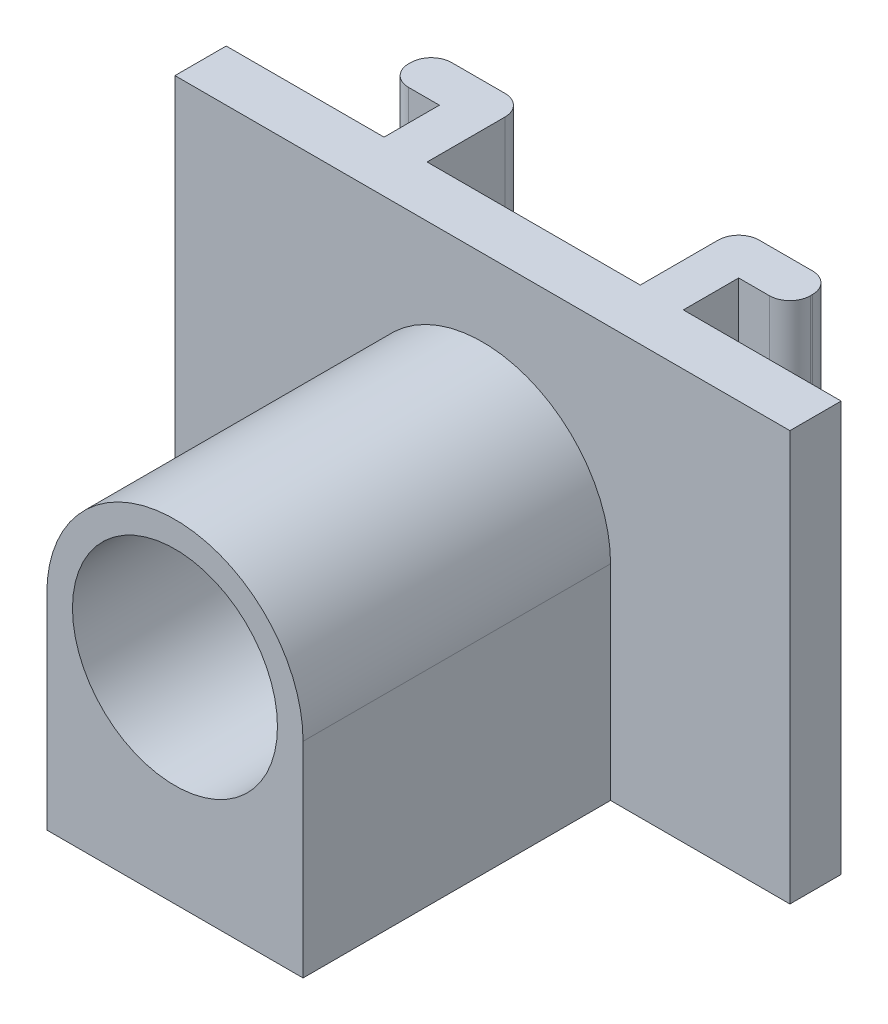
ISO-10303-21;
HEADER;
FILE_DESCRIPTION(('STEP AP214'),'2;1');
FILE_NAME('part.step','',(''),(''),'','','');
FILE_SCHEMA(('AUTOMOTIVE_DESIGN { 1 0 10303 214 1 1 1 1 }'));
ENDSEC;
DATA;
#1=APPLICATION_CONTEXT('core data for automotive mechanical design processes');
#2=APPLICATION_PROTOCOL_DEFINITION('international standard','automotive_design',2000,#1);
#3=PRODUCT_CONTEXT('',#1,'mechanical');
#4=PRODUCT('Part','Part','',(#3));
#5=PRODUCT_RELATED_PRODUCT_CATEGORY('part','',(#4));
#6=PRODUCT_DEFINITION_FORMATION('','',#4);
#7=PRODUCT_DEFINITION_CONTEXT('part definition',#1,'design');
#8=PRODUCT_DEFINITION('design','',#6,#7);
#9=PRODUCT_DEFINITION_SHAPE('','',#8);
#10=(LENGTH_UNIT() NAMED_UNIT(*) SI_UNIT(.MILLI.,.METRE.));
#11=(NAMED_UNIT(*) PLANE_ANGLE_UNIT() SI_UNIT($,.RADIAN.));
#12=(NAMED_UNIT(*) SI_UNIT($,.STERADIAN.) SOLID_ANGLE_UNIT());
#13=UNCERTAINTY_MEASURE_WITH_UNIT(LENGTH_MEASURE(1.E-05),#10,'distance_accuracy_value','');
#14=(GEOMETRIC_REPRESENTATION_CONTEXT(3) GLOBAL_UNCERTAINTY_ASSIGNED_CONTEXT((#13)) GLOBAL_UNIT_ASSIGNED_CONTEXT((#10,
#11,#12)) REPRESENTATION_CONTEXT('',''));
#15=CARTESIAN_POINT('',(0.,0.,0.));
#16=DIRECTION('',(0.,0.,1.));
#17=DIRECTION('',(1.,0.,0.));
#18=AXIS2_PLACEMENT_3D('',#15,#16,#17);
#19=CARTESIAN_POINT('',(0.,0.,3.175));
#20=DIRECTION('',(0.,0.,-1.));
#21=DIRECTION('',(-1.,0.,0.));
#22=AXIS2_PLACEMENT_3D('',#19,#20,#21);
#23=PLANE('',#22);
#24=DIRECTION('',(0.,1.,0.));
#25=VECTOR('',#24,1.);
#26=CARTESIAN_POINT('',(7.9375,0.,3.175));
#27=LINE('',#26,#25);
#28=CARTESIAN_POINT('',(7.93749999999999,-12.7,3.175));
#29=VERTEX_POINT('',#28);
#30=CARTESIAN_POINT('',(7.9375,0.,3.175));
#31=VERTEX_POINT('',#30);
#32=EDGE_CURVE('E224',#29,#31,#27,.T.);
#33=ORIENTED_EDGE('',*,*,#32,.F.);
#34=DIRECTION('',(1.,0.,0.));
#35=VECTOR('',#34,1.);
#36=CARTESIAN_POINT('',(-19.05,-12.7,3.175));
#37=LINE('',#36,#35);
#38=CARTESIAN_POINT('',(19.05,-12.7,3.175));
#39=VERTEX_POINT('',#38);
#40=EDGE_CURVE('E322',#29,#39,#37,.T.);
#41=ORIENTED_EDGE('',*,*,#40,.T.);
#42=DIRECTION('',(0.,1.,0.));
#43=VECTOR('',#42,1.);
#44=CARTESIAN_POINT('',(19.05,-12.7,3.175));
#45=LINE('',#44,#43);
#46=CARTESIAN_POINT('',(19.05,12.7,3.175));
#47=VERTEX_POINT('',#46);
#48=EDGE_CURVE('E314',#39,#47,#45,.T.);
#49=ORIENTED_EDGE('',*,*,#48,.T.);
#50=DIRECTION('',(-1.,0.,0.));
#51=VECTOR('',#50,1.);
#52=CARTESIAN_POINT('',(-19.05,12.7,3.175));
#53=LINE('',#52,#51);
#54=CARTESIAN_POINT('',(-19.05,12.7,3.175));
#55=VERTEX_POINT('',#54);
#56=EDGE_CURVE('E317',#47,#55,#53,.T.);
#57=ORIENTED_EDGE('',*,*,#56,.T.);
#58=DIRECTION('',(0.,-1.,0.));
#59=VECTOR('',#58,1.);
#60=CARTESIAN_POINT('',(-19.05,-12.7,3.175));
#61=LINE('',#60,#59);
#62=CARTESIAN_POINT('',(-19.05,-12.7,3.175));
#63=VERTEX_POINT('',#62);
#64=EDGE_CURVE('E320',#55,#63,#61,.T.);
#65=ORIENTED_EDGE('',*,*,#64,.T.);
#66=CARTESIAN_POINT('',(-7.9375,-12.7,3.175));
#67=VERTEX_POINT('',#66);
#68=EDGE_CURVE('E330',#63,#67,#37,.T.);
#69=ORIENTED_EDGE('',*,*,#68,.T.);
#70=DIRECTION('',(0.,-1.,0.));
#71=VECTOR('',#70,1.);
#72=CARTESIAN_POINT('',(-7.9375,-12.7,3.175));
#73=LINE('',#72,#71);
#74=CARTESIAN_POINT('',(-7.9375,0.,3.175));
#75=VERTEX_POINT('',#74);
#76=EDGE_CURVE('E55',#75,#67,#73,.T.);
#77=ORIENTED_EDGE('',*,*,#76,.F.);
#78=CARTESIAN_POINT('',(0.,0.,3.175));
#79=DIRECTION('',(0.,0.,1.));
#80=DIRECTION('',(-1.,0.,0.));
#81=AXIS2_PLACEMENT_3D('',#78,#79,#80);
#82=CIRCLE('',#81,7.9375);
#83=EDGE_CURVE('E50',#31,#75,#82,.T.);
#84=ORIENTED_EDGE('',*,*,#83,.F.);
#85=EDGE_LOOP('',(#33,#41,#49,#57,#65,#69,#77,#84));
#86=FACE_BOUND('',#85,.T.);
#87=ADVANCED_FACE('F33',(#86),#23,.F.);
#88=CARTESIAN_POINT('',(-19.05,12.7,3.175));
#89=DIRECTION('',(0.,-1.,0.));
#90=DIRECTION('',(0.,0.,-1.));
#91=AXIS2_PLACEMENT_3D('',#88,#89,#90);
#92=PLANE('',#91);
#93=DIRECTION('',(0.,0.,-1.));
#94=VECTOR('',#93,1.);
#95=CARTESIAN_POINT('',(-6.60399999999998,12.7,0.));
#96=LINE('',#95,#94);
#97=CARTESIAN_POINT('',(-6.60399999999998,12.7,0.));
#98=VERTEX_POINT('',#97);
#99=CARTESIAN_POINT('',(-6.60399999999998,12.7,-4.826));
#100=VERTEX_POINT('',#99);
#101=EDGE_CURVE('E259',#98,#100,#96,.T.);
#102=ORIENTED_EDGE('',*,*,#101,.T.);
#103=CARTESIAN_POINT('',(-7.87399999999997,12.7,-4.82600000000001));
#104=DIRECTION('',(0.,-1.,0.));
#105=DIRECTION('',(0.,0.,-1.));
#106=AXIS2_PLACEMENT_3D('',#103,#104,#105);
#107=CIRCLE('',#106,1.27);
#108=CARTESIAN_POINT('',(-7.87399999999997,12.7,-6.09600000000001));
#109=VERTEX_POINT('',#108);
#110=EDGE_CURVE('E369',#100,#109,#107,.F.);
#111=ORIENTED_EDGE('',*,*,#110,.T.);
#112=DIRECTION('',(-1.,0.,0.));
#113=VECTOR('',#112,1.);
#114=CARTESIAN_POINT('',(-6.60399999999997,12.7,-6.09600000000001));
#115=LINE('',#114,#113);
#116=CARTESIAN_POINT('',(-11.176,12.7,-6.09600000000001));
#117=VERTEX_POINT('',#116);
#118=EDGE_CURVE('E256',#109,#117,#115,.T.);
#119=ORIENTED_EDGE('',*,*,#118,.T.);
#120=CARTESIAN_POINT('',(-11.176,12.7,-4.82600000000001));
#121=DIRECTION('',(0.,-1.,0.));
#122=DIRECTION('',(0.,0.,-1.));
#123=AXIS2_PLACEMENT_3D('',#120,#121,#122);
#124=CIRCLE('',#123,1.27);
#125=CARTESIAN_POINT('',(-12.446,12.7,-4.826));
#126=VERTEX_POINT('',#125);
#127=EDGE_CURVE('E373',#117,#126,#124,.F.);
#128=ORIENTED_EDGE('',*,*,#127,.T.);
#129=DIRECTION('',(0.,0.,1.));
#130=VECTOR('',#129,1.);
#131=CARTESIAN_POINT('',(-12.446,12.7,-6.09600000000001));
#132=LINE('',#131,#130);
#133=CARTESIAN_POINT('',(-12.446,12.7,-4.699));
#134=VERTEX_POINT('',#133);
#135=EDGE_CURVE('E253',#126,#134,#132,.T.);
#136=ORIENTED_EDGE('',*,*,#135,.T.);
#137=CARTESIAN_POINT('',(-11.176,12.7,-4.69900000000001));
#138=DIRECTION('',(0.,-1.,0.));
#139=DIRECTION('',(0.,0.,-1.));
#140=AXIS2_PLACEMENT_3D('',#137,#138,#139);
#141=CIRCLE('',#140,1.27);
#142=CARTESIAN_POINT('',(-11.176,12.7,-3.42900000000001));
#143=VERTEX_POINT('',#142);
#144=EDGE_CURVE('E371',#134,#143,#141,.F.);
#145=ORIENTED_EDGE('',*,*,#144,.T.);
#146=DIRECTION('',(1.,0.,0.));
#147=VECTOR('',#146,1.);
#148=CARTESIAN_POINT('',(-12.446,12.7,-3.42900000000001));
#149=LINE('',#148,#147);
#150=CARTESIAN_POINT('',(-9.27099999999998,12.7,-3.42900000000001));
#151=VERTEX_POINT('',#150);
#152=EDGE_CURVE('E251',#143,#151,#149,.T.);
#153=ORIENTED_EDGE('',*,*,#152,.T.);
#154=DIRECTION('',(0.,0.,1.));
#155=VECTOR('',#154,1.);
#156=CARTESIAN_POINT('',(-9.27099999999998,12.7,-3.42900000000001));
#157=LINE('',#156,#155);
#158=CARTESIAN_POINT('',(-9.27099999999998,12.7,0.));
#159=VERTEX_POINT('',#158);
#160=EDGE_CURVE('E248',#151,#159,#157,.T.);
#161=ORIENTED_EDGE('',*,*,#160,.T.);
#162=DIRECTION('',(-1.,0.,0.));
#163=VECTOR('',#162,1.);
#164=CARTESIAN_POINT('',(-19.05,12.7,0.));
#165=LINE('',#164,#163);
#166=CARTESIAN_POINT('',(-19.05,12.7,0.));
#167=VERTEX_POINT('',#166);
#168=EDGE_CURVE('E385',#159,#167,#165,.T.);
#169=ORIENTED_EDGE('',*,*,#168,.T.);
#170=DIRECTION('',(0.,0.,-1.));
#171=VECTOR('',#170,1.);
#172=CARTESIAN_POINT('',(-19.05,12.7,3.175));
#173=LINE('',#172,#171);
#174=EDGE_CURVE('E403',#55,#167,#173,.T.);
#175=ORIENTED_EDGE('',*,*,#174,.F.);
#176=ORIENTED_EDGE('',*,*,#56,.F.);
#177=DIRECTION('',(0.,0.,-1.));
#178=VECTOR('',#177,1.);
#179=CARTESIAN_POINT('',(19.05,12.7,3.175));
#180=LINE('',#179,#178);
#181=CARTESIAN_POINT('',(19.05,12.7,0.));
#182=VERTEX_POINT('',#181);
#183=EDGE_CURVE('E384',#47,#182,#180,.T.);
#184=ORIENTED_EDGE('',*,*,#183,.T.);
#185=CARTESIAN_POINT('',(9.27099999999997,12.7,0.));
#186=VERTEX_POINT('',#185);
#187=EDGE_CURVE('E387',#182,#186,#165,.T.);
#188=ORIENTED_EDGE('',*,*,#187,.T.);
#189=DIRECTION('',(0.,0.,1.));
#190=VECTOR('',#189,1.);
#191=CARTESIAN_POINT('',(9.27099999999997,12.7,-3.429));
#192=LINE('',#191,#190);
#193=CARTESIAN_POINT('',(9.27099999999997,12.7,-3.429));
#194=VERTEX_POINT('',#193);
#195=EDGE_CURVE('E296',#194,#186,#192,.T.);
#196=ORIENTED_EDGE('',*,*,#195,.F.);
#197=DIRECTION('',(-1.,0.,0.));
#198=VECTOR('',#197,1.);
#199=CARTESIAN_POINT('',(12.446,12.7,-3.429));
#200=LINE('',#199,#198);
#201=CARTESIAN_POINT('',(11.176,12.7,-3.429));
#202=VERTEX_POINT('',#201);
#203=EDGE_CURVE('E294',#202,#194,#200,.T.);
#204=ORIENTED_EDGE('',*,*,#203,.F.);
#205=CARTESIAN_POINT('',(11.176,12.7,-4.699));
#206=DIRECTION('',(0.,-1.,0.));
#207=DIRECTION('',(0.,0.,-1.));
#208=AXIS2_PLACEMENT_3D('',#205,#206,#207);
#209=CIRCLE('',#208,1.27);
#210=CARTESIAN_POINT('',(12.446,12.7,-4.69899999999999));
#211=VERTEX_POINT('',#210);
#212=EDGE_CURVE('E375',#202,#211,#209,.F.);
#213=ORIENTED_EDGE('',*,*,#212,.T.);
#214=DIRECTION('',(0.,0.,1.));
#215=VECTOR('',#214,1.);
#216=CARTESIAN_POINT('',(12.446,12.7,-6.096));
#217=LINE('',#216,#215);
#218=CARTESIAN_POINT('',(12.446,12.7,-4.82599999999999));
#219=VERTEX_POINT('',#218);
#220=EDGE_CURVE('E291',#219,#211,#217,.T.);
#221=ORIENTED_EDGE('',*,*,#220,.F.);
#222=CARTESIAN_POINT('',(11.176,12.7,-4.826));
#223=DIRECTION('',(0.,-1.,0.));
#224=DIRECTION('',(0.,0.,-1.));
#225=AXIS2_PLACEMENT_3D('',#222,#223,#224);
#226=CIRCLE('',#225,1.27);
#227=CARTESIAN_POINT('',(11.176,12.7,-6.096));
#228=VERTEX_POINT('',#227);
#229=EDGE_CURVE('E377',#219,#228,#226,.F.);
#230=ORIENTED_EDGE('',*,*,#229,.T.);
#231=DIRECTION('',(1.,0.,0.));
#232=VECTOR('',#231,1.);
#233=CARTESIAN_POINT('',(6.60399999999998,12.7,-6.096));
#234=LINE('',#233,#232);
#235=CARTESIAN_POINT('',(7.87399999999997,12.7,-6.096));
#236=VERTEX_POINT('',#235);
#237=EDGE_CURVE('E288',#236,#228,#234,.T.);
#238=ORIENTED_EDGE('',*,*,#237,.F.);
#239=CARTESIAN_POINT('',(7.87399999999997,12.7,-4.826));
#240=DIRECTION('',(0.,-1.,0.));
#241=DIRECTION('',(0.,0.,-1.));
#242=AXIS2_PLACEMENT_3D('',#239,#240,#241);
#243=CIRCLE('',#242,1.27);
#244=CARTESIAN_POINT('',(6.60399999999998,12.7,-4.826));
#245=VERTEX_POINT('',#244);
#246=EDGE_CURVE('E379',#236,#245,#243,.F.);
#247=ORIENTED_EDGE('',*,*,#246,.T.);
#248=DIRECTION('',(0.,0.,-1.));
#249=VECTOR('',#248,1.);
#250=CARTESIAN_POINT('',(6.60399999999998,12.7,0.));
#251=LINE('',#250,#249);
#252=CARTESIAN_POINT('',(6.60399999999998,12.7,0.));
#253=VERTEX_POINT('',#252);
#254=EDGE_CURVE('E285',#253,#245,#251,.T.);
#255=ORIENTED_EDGE('',*,*,#254,.F.);
#256=DIRECTION('',(1.,0.,0.));
#257=VECTOR('',#256,1.);
#258=CARTESIAN_POINT('',(6.34999999999998,12.7,0.));
#259=LINE('',#258,#257);
#260=EDGE_CURVE('E311',#98,#253,#259,.T.);
#261=ORIENTED_EDGE('',*,*,#260,.F.);
#262=EDGE_LOOP('',(#102,#111,#119,#128,#136,#145,#153,#161,#169,#175,#176,#184,#188,#196,#204,
#213,#221,#230,#238,#247,#255,#261));
#263=FACE_BOUND('',#262,.T.);
#264=ADVANCED_FACE('F425',(#263),#92,.F.);
#265=CARTESIAN_POINT('',(-19.05,-12.7,3.175));
#266=DIRECTION('',(0.,1.,0.));
#267=DIRECTION('',(0.,0.,1.));
#268=AXIS2_PLACEMENT_3D('',#265,#266,#267);
#269=PLANE('',#268);
#270=DIRECTION('',(1.,0.,0.));
#271=VECTOR('',#270,1.);
#272=CARTESIAN_POINT('',(-6.60399999999997,-12.7,-6.09600000000001));
#273=LINE('',#272,#271);
#274=CARTESIAN_POINT('',(-11.176,-12.7,-6.09600000000001));
#275=VERTEX_POINT('',#274);
#276=CARTESIAN_POINT('',(-7.87399999999997,-12.7,-6.09600000000001));
#277=VERTEX_POINT('',#276);
#278=EDGE_CURVE('E243',#275,#277,#273,.T.);
#279=ORIENTED_EDGE('',*,*,#278,.T.);
#280=CARTESIAN_POINT('',(-7.87399999999997,-12.7,-4.82600000000001));
#281=DIRECTION('',(0.,1.,0.));
#282=DIRECTION('',(0.,0.,1.));
#283=AXIS2_PLACEMENT_3D('',#280,#281,#282);
#284=CIRCLE('',#283,1.27);
#285=CARTESIAN_POINT('',(-6.60399999999997,-12.7,-4.826));
#286=VERTEX_POINT('',#285);
#287=EDGE_CURVE('E352',#277,#286,#284,.F.);
#288=ORIENTED_EDGE('',*,*,#287,.T.);
#289=DIRECTION('',(0.,0.,1.));
#290=VECTOR('',#289,1.);
#291=CARTESIAN_POINT('',(-6.60399999999997,-12.7,0.));
#292=LINE('',#291,#290);
#293=CARTESIAN_POINT('',(-6.60399999999997,-12.7,0.));
#294=VERTEX_POINT('',#293);
#295=EDGE_CURVE('E246',#286,#294,#292,.T.);
#296=ORIENTED_EDGE('',*,*,#295,.T.);
#297=DIRECTION('',(-1.,0.,0.));
#298=VECTOR('',#297,1.);
#299=CARTESIAN_POINT('',(6.34999999999998,-12.7,0.));
#300=LINE('',#299,#298);
#301=CARTESIAN_POINT('',(6.60399999999998,-12.7,0.));
#302=VERTEX_POINT('',#301);
#303=EDGE_CURVE('E303',#302,#294,#300,.T.);
#304=ORIENTED_EDGE('',*,*,#303,.F.);
#305=DIRECTION('',(0.,0.,1.));
#306=VECTOR('',#305,1.);
#307=CARTESIAN_POINT('',(6.60399999999998,-12.7,0.));
#308=LINE('',#307,#306);
#309=CARTESIAN_POINT('',(6.60399999999998,-12.7,-4.826));
#310=VERTEX_POINT('',#309);
#311=EDGE_CURVE('E266',#310,#302,#308,.T.);
#312=ORIENTED_EDGE('',*,*,#311,.F.);
#313=CARTESIAN_POINT('',(7.87399999999997,-12.7,-4.826));
#314=DIRECTION('',(0.,1.,0.));
#315=DIRECTION('',(0.,0.,1.));
#316=AXIS2_PLACEMENT_3D('',#313,#314,#315);
#317=CIRCLE('',#316,1.27);
#318=CARTESIAN_POINT('',(7.87399999999997,-12.7,-6.096));
#319=VERTEX_POINT('',#318);
#320=EDGE_CURVE('E362',#310,#319,#317,.F.);
#321=ORIENTED_EDGE('',*,*,#320,.T.);
#322=DIRECTION('',(-1.,0.,0.));
#323=VECTOR('',#322,1.);
#324=CARTESIAN_POINT('',(6.60399999999998,-12.7,-6.096));
#325=LINE('',#324,#323);
#326=CARTESIAN_POINT('',(11.176,-12.7,-6.096));
#327=VERTEX_POINT('',#326);
#328=EDGE_CURVE('E273',#327,#319,#325,.T.);
#329=ORIENTED_EDGE('',*,*,#328,.F.);
#330=CARTESIAN_POINT('',(11.176,-12.7,-4.826));
#331=DIRECTION('',(0.,1.,0.));
#332=DIRECTION('',(0.,0.,1.));
#333=AXIS2_PLACEMENT_3D('',#330,#331,#332);
#334=CIRCLE('',#333,1.27);
#335=CARTESIAN_POINT('',(12.446,-12.7,-4.82599999999999));
#336=VERTEX_POINT('',#335);
#337=EDGE_CURVE('E360',#327,#336,#334,.F.);
#338=ORIENTED_EDGE('',*,*,#337,.T.);
#339=DIRECTION('',(0.,0.,-1.));
#340=VECTOR('',#339,1.);
#341=CARTESIAN_POINT('',(12.446,-12.7,-6.096));
#342=LINE('',#341,#340);
#343=CARTESIAN_POINT('',(12.446,-12.7,-4.69899999999999));
#344=VERTEX_POINT('',#343);
#345=EDGE_CURVE('E276',#344,#336,#342,.T.);
#346=ORIENTED_EDGE('',*,*,#345,.F.);
#347=CARTESIAN_POINT('',(11.176,-12.7,-4.699));
#348=DIRECTION('',(0.,1.,0.));
#349=DIRECTION('',(0.,0.,1.));
#350=AXIS2_PLACEMENT_3D('',#347,#348,#349);
#351=CIRCLE('',#350,1.27);
#352=CARTESIAN_POINT('',(11.176,-12.7,-3.429));
#353=VERTEX_POINT('',#352);
#354=EDGE_CURVE('E358',#344,#353,#351,.F.);
#355=ORIENTED_EDGE('',*,*,#354,.T.);
#356=DIRECTION('',(1.,0.,0.));
#357=VECTOR('',#356,1.);
#358=CARTESIAN_POINT('',(12.446,-12.7,-3.429));
#359=LINE('',#358,#357);
#360=CARTESIAN_POINT('',(9.27099999999997,-12.7,-3.429));
#361=VERTEX_POINT('',#360);
#362=EDGE_CURVE('E279',#361,#353,#359,.T.);
#363=ORIENTED_EDGE('',*,*,#362,.F.);
#364=DIRECTION('',(0.,0.,-1.));
#365=VECTOR('',#364,1.);
#366=CARTESIAN_POINT('',(9.27099999999997,-12.7,-3.429));
#367=LINE('',#366,#365);
#368=CARTESIAN_POINT('',(9.27099999999997,-12.7,0.));
#369=VERTEX_POINT('',#368);
#370=EDGE_CURVE('E282',#369,#361,#367,.T.);
#371=ORIENTED_EDGE('',*,*,#370,.F.);
#372=DIRECTION('',(1.,0.,0.));
#373=VECTOR('',#372,1.);
#374=CARTESIAN_POINT('',(-19.05,-12.7,0.));
#375=LINE('',#374,#373);
#376=CARTESIAN_POINT('',(19.05,-12.7,0.));
#377=VERTEX_POINT('',#376);
#378=EDGE_CURVE('E394',#369,#377,#375,.T.);
#379=ORIENTED_EDGE('',*,*,#378,.T.);
#380=DIRECTION('',(0.,0.,-1.));
#381=VECTOR('',#380,1.);
#382=CARTESIAN_POINT('',(19.05,-12.7,3.175));
#383=LINE('',#382,#381);
#384=EDGE_CURVE('E331',#39,#377,#383,.T.);
#385=ORIENTED_EDGE('',*,*,#384,.F.);
#386=ORIENTED_EDGE('',*,*,#40,.F.);
#387=DIRECTION('',(0.,0.,-1.));
#388=VECTOR('',#387,1.);
#389=CARTESIAN_POINT('',(7.9375,-12.7,22.225));
#390=LINE('',#389,#388);
#391=CARTESIAN_POINT('',(7.9375,-12.7,22.225));
#392=VERTEX_POINT('',#391);
#393=EDGE_CURVE('E232',#392,#29,#390,.T.);
#394=ORIENTED_EDGE('',*,*,#393,.F.);
#395=DIRECTION('',(1.,0.,0.));
#396=VECTOR('',#395,1.);
#397=CARTESIAN_POINT('',(7.9375,-12.7,22.225));
#398=LINE('',#397,#396);
#399=CARTESIAN_POINT('',(-7.9375,-12.7,22.225));
#400=VERTEX_POINT('',#399);
#401=EDGE_CURVE('E214',#400,#392,#398,.T.);
#402=ORIENTED_EDGE('',*,*,#401,.F.);
#403=DIRECTION('',(0.,0.,-1.));
#404=VECTOR('',#403,1.);
#405=CARTESIAN_POINT('',(-7.9375,-12.7,22.225));
#406=LINE('',#405,#404);
#407=EDGE_CURVE('E211',#400,#67,#406,.T.);
#408=ORIENTED_EDGE('',*,*,#407,.T.);
#409=ORIENTED_EDGE('',*,*,#68,.F.);
#410=DIRECTION('',(0.,0.,-1.));
#411=VECTOR('',#410,1.);
#412=CARTESIAN_POINT('',(-19.05,-12.7,3.175));
#413=LINE('',#412,#411);
#414=CARTESIAN_POINT('',(-19.05,-12.7,0.));
#415=VERTEX_POINT('',#414);
#416=EDGE_CURVE('E405',#63,#415,#413,.T.);
#417=ORIENTED_EDGE('',*,*,#416,.T.);
#418=CARTESIAN_POINT('',(-9.27099999999997,-12.7,0.));
#419=VERTEX_POINT('',#418);
#420=EDGE_CURVE('E318',#415,#419,#375,.T.);
#421=ORIENTED_EDGE('',*,*,#420,.T.);
#422=DIRECTION('',(0.,0.,-1.));
#423=VECTOR('',#422,1.);
#424=CARTESIAN_POINT('',(-9.27099999999997,-12.7,-3.42900000000001));
#425=LINE('',#424,#423);
#426=CARTESIAN_POINT('',(-9.27099999999997,-12.7,-3.42900000000001));
#427=VERTEX_POINT('',#426);
#428=EDGE_CURVE('E227',#419,#427,#425,.T.);
#429=ORIENTED_EDGE('',*,*,#428,.T.);
#430=DIRECTION('',(-1.,0.,0.));
#431=VECTOR('',#430,1.);
#432=CARTESIAN_POINT('',(-12.446,-12.7,-3.42900000000001));
#433=LINE('',#432,#431);
#434=CARTESIAN_POINT('',(-11.176,-12.7,-3.42900000000001));
#435=VERTEX_POINT('',#434);
#436=EDGE_CURVE('E230',#427,#435,#433,.T.);
#437=ORIENTED_EDGE('',*,*,#436,.T.);
#438=CARTESIAN_POINT('',(-11.176,-12.7,-4.69900000000001));
#439=DIRECTION('',(0.,1.,0.));
#440=DIRECTION('',(0.,0.,1.));
#441=AXIS2_PLACEMENT_3D('',#438,#439,#440);
#442=CIRCLE('',#441,1.27);
#443=CARTESIAN_POINT('',(-12.446,-12.7,-4.699));
#444=VERTEX_POINT('',#443);
#445=EDGE_CURVE('E354',#435,#444,#442,.F.);
#446=ORIENTED_EDGE('',*,*,#445,.T.);
#447=DIRECTION('',(0.,0.,-1.));
#448=VECTOR('',#447,1.);
#449=CARTESIAN_POINT('',(-12.446,-12.7,-6.09600000000001));
#450=LINE('',#449,#448);
#451=CARTESIAN_POINT('',(-12.446,-12.7,-4.826));
#452=VERTEX_POINT('',#451);
#453=EDGE_CURVE('E240',#444,#452,#450,.T.);
#454=ORIENTED_EDGE('',*,*,#453,.T.);
#455=CARTESIAN_POINT('',(-11.176,-12.7,-4.82600000000001));
#456=DIRECTION('',(0.,1.,0.));
#457=DIRECTION('',(0.,0.,1.));
#458=AXIS2_PLACEMENT_3D('',#455,#456,#457);
#459=CIRCLE('',#458,1.27);
#460=EDGE_CURVE('E356',#452,#275,#459,.F.);
#461=ORIENTED_EDGE('',*,*,#460,.T.);
#462=EDGE_LOOP('',(#279,#288,#296,#304,#312,#321,#329,#338,#346,#355,#363,#371,#379,#385,#386,
#394,#402,#408,#409,#417,#421,#429,#437,#446,#454,#461));
#463=FACE_BOUND('',#462,.T.);
#464=ADVANCED_FACE('F430',(#463),#269,.F.);
#465=CARTESIAN_POINT('',(0.,0.,0.));
#466=DIRECTION('',(0.,0.,-1.));
#467=DIRECTION('',(-1.,0.,0.));
#468=AXIS2_PLACEMENT_3D('',#465,#466,#467);
#469=PLANE('',#468);
#470=ORIENTED_EDGE('',*,*,#378,.F.);
#471=DIRECTION('',(0.,1.,0.));
#472=VECTOR('',#471,1.);
#473=CARTESIAN_POINT('',(9.27099999999997,-12.70105,0.));
#474=LINE('',#473,#472);
#475=EDGE_CURVE('E300',#369,#186,#474,.T.);
#476=ORIENTED_EDGE('',*,*,#475,.T.);
#477=ORIENTED_EDGE('',*,*,#187,.F.);
#478=DIRECTION('',(0.,1.,0.));
#479=VECTOR('',#478,1.);
#480=CARTESIAN_POINT('',(19.05,-12.7,0.));
#481=LINE('',#480,#479);
#482=EDGE_CURVE('E313',#377,#182,#481,.T.);
#483=ORIENTED_EDGE('',*,*,#482,.F.);
#484=EDGE_LOOP('',(#470,#476,#477,#483));
#485=FACE_BOUND('',#484,.T.);
#486=ADVANCED_FACE('F421',(#485),#469,.T.);
#487=CARTESIAN_POINT('',(19.05,-12.7,3.175));
#488=DIRECTION('',(-1.,0.,0.));
#489=DIRECTION('',(0.,0.,1.));
#490=AXIS2_PLACEMENT_3D('',#487,#488,#489);
#491=PLANE('',#490);
#492=ORIENTED_EDGE('',*,*,#482,.T.);
#493=ORIENTED_EDGE('',*,*,#183,.F.);
#494=ORIENTED_EDGE('',*,*,#48,.F.);
#495=ORIENTED_EDGE('',*,*,#384,.T.);
#496=EDGE_LOOP('',(#492,#493,#494,#495));
#497=FACE_BOUND('',#496,.T.);
#498=ADVANCED_FACE('F417',(#497),#491,.F.);
#499=CARTESIAN_POINT('',(-19.05,-12.7,3.175));
#500=DIRECTION('',(1.,0.,0.));
#501=DIRECTION('',(0.,0.,-1.));
#502=AXIS2_PLACEMENT_3D('',#499,#500,#501);
#503=PLANE('',#502);
#504=DIRECTION('',(0.,-1.,0.));
#505=VECTOR('',#504,1.);
#506=CARTESIAN_POINT('',(-19.05,-12.7,0.));
#507=LINE('',#506,#505);
#508=EDGE_CURVE('E391',#167,#415,#507,.T.);
#509=ORIENTED_EDGE('',*,*,#508,.T.);
#510=ORIENTED_EDGE('',*,*,#416,.F.);
#511=ORIENTED_EDGE('',*,*,#64,.F.);
#512=ORIENTED_EDGE('',*,*,#174,.T.);
#513=EDGE_LOOP('',(#509,#510,#511,#512));
#514=FACE_BOUND('',#513,.T.);
#515=ADVANCED_FACE('F474',(#514),#503,.F.);
#516=ORIENTED_EDGE('',*,*,#168,.F.);
#517=DIRECTION('',(0.,1.,0.));
#518=VECTOR('',#517,1.);
#519=CARTESIAN_POINT('',(-9.27099999999997,-12.701,0.));
#520=LINE('',#519,#518);
#521=EDGE_CURVE('E262',#419,#159,#520,.T.);
#522=ORIENTED_EDGE('',*,*,#521,.F.);
#523=ORIENTED_EDGE('',*,*,#420,.F.);
#524=ORIENTED_EDGE('',*,*,#508,.F.);
#525=EDGE_LOOP('',(#516,#522,#523,#524));
#526=FACE_BOUND('',#525,.T.);
#527=ADVANCED_FACE('F471',(#526),#469,.T.);
#528=CARTESIAN_POINT('',(6.34999999999998,-12.70105,0.));
#529=DIRECTION('',(0.,0.,1.));
#530=DIRECTION('',(1.,0.,0.));
#531=AXIS2_PLACEMENT_3D('',#528,#529,#530);
#532=PLANE('',#531);
#533=CARTESIAN_POINT('',(0.,0.,0.));
#534=DIRECTION('',(0.,0.,1.));
#535=DIRECTION('',(1.,0.,0.));
#536=AXIS2_PLACEMENT_3D('',#533,#534,#535);
#537=CIRCLE('',#536,6.35);
#538=CARTESIAN_POINT('',(6.35,0.,0.));
#539=VERTEX_POINT('',#538);
#540=EDGE_CURVE('E441',#539,#539,#537,.F.);
#541=ORIENTED_EDGE('',*,*,#540,.F.);
#542=EDGE_LOOP('',(#541));
#543=FACE_BOUND('',#542,.T.);
#544=ORIENTED_EDGE('',*,*,#303,.T.);
#545=DIRECTION('',(0.,1.,0.));
#546=VECTOR('',#545,1.);
#547=CARTESIAN_POINT('',(-6.60399999999997,-12.701,0.));
#548=LINE('',#547,#546);
#549=EDGE_CURVE('E263',#294,#98,#548,.T.);
#550=ORIENTED_EDGE('',*,*,#549,.T.);
#551=ORIENTED_EDGE('',*,*,#260,.T.);
#552=DIRECTION('',(0.,1.,0.));
#553=VECTOR('',#552,1.);
#554=CARTESIAN_POINT('',(6.60399999999998,-12.70105,0.));
#555=LINE('',#554,#553);
#556=EDGE_CURVE('E299',#302,#253,#555,.T.);
#557=ORIENTED_EDGE('',*,*,#556,.F.);
#558=EDGE_LOOP('',(#544,#550,#551,#557));
#559=FACE_BOUND('',#558,.T.);
#560=ADVANCED_FACE('F469',(#543,#559),#532,.F.);
#561=CARTESIAN_POINT('',(9.27099999999997,-12.70105,-3.429));
#562=DIRECTION('',(-1.,0.,0.));
#563=DIRECTION('',(0.,0.,1.));
#564=AXIS2_PLACEMENT_3D('',#561,#562,#563);
#565=PLANE('',#564);
#566=ORIENTED_EDGE('',*,*,#370,.T.);
#567=DIRECTION('',(0.,1.,0.));
#568=VECTOR('',#567,1.);
#569=CARTESIAN_POINT('',(9.27099999999997,-12.70105,-3.429));
#570=LINE('',#569,#568);
#571=EDGE_CURVE('E304',#361,#194,#570,.T.);
#572=ORIENTED_EDGE('',*,*,#571,.T.);
#573=ORIENTED_EDGE('',*,*,#195,.T.);
#574=ORIENTED_EDGE('',*,*,#475,.F.);
#575=EDGE_LOOP('',(#566,#572,#573,#574));
#576=FACE_BOUND('',#575,.T.);
#577=ADVANCED_FACE('F523',(#576),#565,.F.);
#578=CARTESIAN_POINT('',(12.446,-12.70105,-3.429));
#579=DIRECTION('',(0.,0.,-1.));
#580=DIRECTION('',(-1.,0.,0.));
#581=AXIS2_PLACEMENT_3D('',#578,#579,#580);
#582=PLANE('',#581);
#583=ORIENTED_EDGE('',*,*,#362,.T.);
#584=DIRECTION('',(0.,1.,0.));
#585=VECTOR('',#584,1.);
#586=CARTESIAN_POINT('',(11.176,-12.70105,-3.429));
#587=LINE('',#586,#585);
#588=EDGE_CURVE('E342',#353,#202,#587,.T.);
#589=ORIENTED_EDGE('',*,*,#588,.T.);
#590=ORIENTED_EDGE('',*,*,#203,.T.);
#591=ORIENTED_EDGE('',*,*,#571,.F.);
#592=EDGE_LOOP('',(#583,#589,#590,#591));
#593=FACE_BOUND('',#592,.T.);
#594=ADVANCED_FACE('F520',(#593),#582,.F.);
#595=CARTESIAN_POINT('',(12.446,-12.70105,-6.096));
#596=DIRECTION('',(-1.,0.,0.));
#597=DIRECTION('',(0.,0.,1.));
#598=AXIS2_PLACEMENT_3D('',#595,#596,#597);
#599=PLANE('',#598);
#600=ORIENTED_EDGE('',*,*,#220,.T.);
#601=DIRECTION('',(0.,1.,0.));
#602=VECTOR('',#601,1.);
#603=CARTESIAN_POINT('',(12.446,-12.70105,-4.69899999999999));
#604=LINE('',#603,#602);
#605=EDGE_CURVE('E337',#211,#344,#604,.F.);
#606=ORIENTED_EDGE('',*,*,#605,.T.);
#607=ORIENTED_EDGE('',*,*,#345,.T.);
#608=DIRECTION('',(0.,1.,0.));
#609=VECTOR('',#608,1.);
#610=CARTESIAN_POINT('',(12.446,-12.70105,-4.82599999999999));
#611=LINE('',#610,#609);
#612=EDGE_CURVE('E339',#336,#219,#611,.T.);
#613=ORIENTED_EDGE('',*,*,#612,.T.);
#614=EDGE_LOOP('',(#600,#606,#607,#613));
#615=FACE_BOUND('',#614,.T.);
#616=ADVANCED_FACE('F513',(#615),#599,.F.);
#617=CARTESIAN_POINT('',(6.60399999999998,-12.70105,-6.096));
#618=DIRECTION('',(0.,0.,1.));
#619=DIRECTION('',(1.,0.,0.));
#620=AXIS2_PLACEMENT_3D('',#617,#618,#619);
#621=PLANE('',#620);
#622=ORIENTED_EDGE('',*,*,#237,.T.);
#623=DIRECTION('',(0.,1.,0.));
#624=VECTOR('',#623,1.);
#625=CARTESIAN_POINT('',(11.176,-12.70105,-6.096));
#626=LINE('',#625,#624);
#627=EDGE_CURVE('E42',#228,#327,#626,.F.);
#628=ORIENTED_EDGE('',*,*,#627,.T.);
#629=ORIENTED_EDGE('',*,*,#328,.T.);
#630=DIRECTION('',(0.,1.,0.));
#631=VECTOR('',#630,1.);
#632=CARTESIAN_POINT('',(7.87399999999997,-12.70105,-6.096));
#633=LINE('',#632,#631);
#634=EDGE_CURVE('E334',#319,#236,#633,.T.);
#635=ORIENTED_EDGE('',*,*,#634,.T.);
#636=EDGE_LOOP('',(#622,#628,#629,#635));
#637=FACE_BOUND('',#636,.T.);
#638=ADVANCED_FACE('F526',(#637),#621,.F.);
#639=CARTESIAN_POINT('',(6.60399999999998,-12.70105,0.));
#640=DIRECTION('',(1.,0.,0.));
#641=DIRECTION('',(0.,0.,-1.));
#642=AXIS2_PLACEMENT_3D('',#639,#640,#641);
#643=PLANE('',#642);
#644=ORIENTED_EDGE('',*,*,#254,.T.);
#645=DIRECTION('',(0.,1.,0.));
#646=VECTOR('',#645,1.);
#647=CARTESIAN_POINT('',(6.60399999999998,-12.70105,-4.826));
#648=LINE('',#647,#646);
#649=EDGE_CURVE('E11',#245,#310,#648,.F.);
#650=ORIENTED_EDGE('',*,*,#649,.T.);
#651=ORIENTED_EDGE('',*,*,#311,.T.);
#652=ORIENTED_EDGE('',*,*,#556,.T.);
#653=EDGE_LOOP('',(#644,#650,#651,#652));
#654=FACE_BOUND('',#653,.T.);
#655=ADVANCED_FACE('F532',(#654),#643,.F.);
#656=CARTESIAN_POINT('',(-6.60399999999997,-12.701,0.));
#657=DIRECTION('',(1.,0.,0.));
#658=DIRECTION('',(0.,0.,-1.));
#659=AXIS2_PLACEMENT_3D('',#656,#657,#658);
#660=PLANE('',#659);
#661=ORIENTED_EDGE('',*,*,#295,.F.);
#662=DIRECTION('',(0.,1.,0.));
#663=VECTOR('',#662,1.);
#664=CARTESIAN_POINT('',(-6.60399999999997,-12.701,-4.826));
#665=LINE('',#664,#663);
#666=EDGE_CURVE('E381',#286,#100,#665,.T.);
#667=ORIENTED_EDGE('',*,*,#666,.T.);
#668=ORIENTED_EDGE('',*,*,#101,.F.);
#669=ORIENTED_EDGE('',*,*,#549,.F.);
#670=EDGE_LOOP('',(#661,#667,#668,#669));
#671=FACE_BOUND('',#670,.T.);
#672=ADVANCED_FACE('F542',(#671),#660,.T.);
#673=CARTESIAN_POINT('',(-6.60399999999997,-12.701,-6.09600000000001));
#674=DIRECTION('',(0.,0.,-1.));
#675=DIRECTION('',(-1.,0.,0.));
#676=AXIS2_PLACEMENT_3D('',#673,#674,#675);
#677=PLANE('',#676);
#678=ORIENTED_EDGE('',*,*,#118,.F.);
#679=DIRECTION('',(0.,1.,0.));
#680=VECTOR('',#679,1.);
#681=CARTESIAN_POINT('',(-7.87399999999997,-12.701,-6.09600000000001));
#682=LINE('',#681,#680);
#683=EDGE_CURVE('E364',#109,#277,#682,.F.);
#684=ORIENTED_EDGE('',*,*,#683,.T.);
#685=ORIENTED_EDGE('',*,*,#278,.F.);
#686=DIRECTION('',(0.,1.,0.));
#687=VECTOR('',#686,1.);
#688=CARTESIAN_POINT('',(-11.176,-12.701,-6.09600000000001));
#689=LINE('',#688,#687);
#690=EDGE_CURVE('E366',#275,#117,#689,.T.);
#691=ORIENTED_EDGE('',*,*,#690,.T.);
#692=EDGE_LOOP('',(#678,#684,#685,#691));
#693=FACE_BOUND('',#692,.T.);
#694=ADVANCED_FACE('F548',(#693),#677,.T.);
#695=CARTESIAN_POINT('',(-12.446,-12.701,-6.09600000000001));
#696=DIRECTION('',(-1.,0.,0.));
#697=DIRECTION('',(0.,0.,1.));
#698=AXIS2_PLACEMENT_3D('',#695,#696,#697);
#699=PLANE('',#698);
#700=ORIENTED_EDGE('',*,*,#453,.F.);
#701=DIRECTION('',(0.,1.,0.));
#702=VECTOR('',#701,1.);
#703=CARTESIAN_POINT('',(-12.446,-12.701,-4.699));
#704=LINE('',#703,#702);
#705=EDGE_CURVE('E347',#444,#134,#704,.T.);
#706=ORIENTED_EDGE('',*,*,#705,.T.);
#707=ORIENTED_EDGE('',*,*,#135,.F.);
#708=DIRECTION('',(0.,1.,0.));
#709=VECTOR('',#708,1.);
#710=CARTESIAN_POINT('',(-12.446,-12.701,-4.826));
#711=LINE('',#710,#709);
#712=EDGE_CURVE('E350',#126,#452,#711,.F.);
#713=ORIENTED_EDGE('',*,*,#712,.T.);
#714=EDGE_LOOP('',(#700,#706,#707,#713));
#715=FACE_BOUND('',#714,.T.);
#716=ADVANCED_FACE('F555',(#715),#699,.T.);
#717=CARTESIAN_POINT('',(-12.446,-12.701,-3.42900000000001));
#718=DIRECTION('',(0.,0.,1.));
#719=DIRECTION('',(1.,0.,0.));
#720=AXIS2_PLACEMENT_3D('',#717,#718,#719);
#721=PLANE('',#720);
#722=ORIENTED_EDGE('',*,*,#152,.F.);
#723=DIRECTION('',(0.,1.,0.));
#724=VECTOR('',#723,1.);
#725=CARTESIAN_POINT('',(-11.176,-12.701,-3.42900000000001));
#726=LINE('',#725,#724);
#727=EDGE_CURVE('E345',#143,#435,#726,.F.);
#728=ORIENTED_EDGE('',*,*,#727,.T.);
#729=ORIENTED_EDGE('',*,*,#436,.F.);
#730=DIRECTION('',(0.,1.,0.));
#731=VECTOR('',#730,1.);
#732=CARTESIAN_POINT('',(-9.27099999999997,-12.701,-3.42900000000001));
#733=LINE('',#732,#731);
#734=EDGE_CURVE('E267',#427,#151,#733,.T.);
#735=ORIENTED_EDGE('',*,*,#734,.T.);
#736=EDGE_LOOP('',(#722,#728,#729,#735));
#737=FACE_BOUND('',#736,.T.);
#738=ADVANCED_FACE('F561',(#737),#721,.T.);
#739=CARTESIAN_POINT('',(-9.27099999999997,-12.701,-3.42900000000001));
#740=DIRECTION('',(-1.,0.,0.));
#741=DIRECTION('',(0.,0.,1.));
#742=AXIS2_PLACEMENT_3D('',#739,#740,#741);
#743=PLANE('',#742);
#744=ORIENTED_EDGE('',*,*,#521,.T.);
#745=ORIENTED_EDGE('',*,*,#160,.F.);
#746=ORIENTED_EDGE('',*,*,#734,.F.);
#747=ORIENTED_EDGE('',*,*,#428,.F.);
#748=EDGE_LOOP('',(#744,#745,#746,#747));
#749=FACE_BOUND('',#748,.T.);
#750=ADVANCED_FACE('F487',(#749),#743,.T.);
#751=CARTESIAN_POINT('',(-7.87399999999997,-12.701,-4.82600000000001));
#752=DIRECTION('',(0.,1.,0.));
#753=DIRECTION('',(-1.,0.,0.));
#754=AXIS2_PLACEMENT_3D('',#751,#752,#753);
#755=CYLINDRICAL_SURFACE('',#754,1.27);
#756=ORIENTED_EDGE('',*,*,#287,.F.);
#757=ORIENTED_EDGE('',*,*,#683,.F.);
#758=ORIENTED_EDGE('',*,*,#110,.F.);
#759=ORIENTED_EDGE('',*,*,#666,.F.);
#760=EDGE_LOOP('',(#756,#757,#758,#759));
#761=FACE_BOUND('',#760,.T.);
#762=ADVANCED_FACE('F483',(#761),#755,.T.);
#763=CARTESIAN_POINT('',(-11.176,-12.701,-4.69900000000001));
#764=DIRECTION('',(0.,1.,0.));
#765=DIRECTION('',(-1.,0.,0.));
#766=AXIS2_PLACEMENT_3D('',#763,#764,#765);
#767=CYLINDRICAL_SURFACE('',#766,1.27);
#768=ORIENTED_EDGE('',*,*,#445,.F.);
#769=ORIENTED_EDGE('',*,*,#727,.F.);
#770=ORIENTED_EDGE('',*,*,#144,.F.);
#771=ORIENTED_EDGE('',*,*,#705,.F.);
#772=EDGE_LOOP('',(#768,#769,#770,#771));
#773=FACE_BOUND('',#772,.T.);
#774=ADVANCED_FACE('F486',(#773),#767,.T.);
#775=CARTESIAN_POINT('',(-11.176,-12.701,-4.82600000000001));
#776=DIRECTION('',(0.,1.,0.));
#777=DIRECTION('',(-1.,0.,0.));
#778=AXIS2_PLACEMENT_3D('',#775,#776,#777);
#779=CYLINDRICAL_SURFACE('',#778,1.27);
#780=ORIENTED_EDGE('',*,*,#460,.F.);
#781=ORIENTED_EDGE('',*,*,#712,.F.);
#782=ORIENTED_EDGE('',*,*,#127,.F.);
#783=ORIENTED_EDGE('',*,*,#690,.F.);
#784=EDGE_LOOP('',(#780,#781,#782,#783));
#785=FACE_BOUND('',#784,.T.);
#786=ADVANCED_FACE('F491',(#785),#779,.T.);
#787=CARTESIAN_POINT('',(11.176,-12.70105,-4.699));
#788=DIRECTION('',(0.,1.,0.));
#789=DIRECTION('',(0.,0.,1.));
#790=AXIS2_PLACEMENT_3D('',#787,#788,#789);
#791=CYLINDRICAL_SURFACE('',#790,1.27);
#792=ORIENTED_EDGE('',*,*,#354,.F.);
#793=ORIENTED_EDGE('',*,*,#605,.F.);
#794=ORIENTED_EDGE('',*,*,#212,.F.);
#795=ORIENTED_EDGE('',*,*,#588,.F.);
#796=EDGE_LOOP('',(#792,#793,#794,#795));
#797=FACE_BOUND('',#796,.T.);
#798=ADVANCED_FACE('F495',(#797),#791,.T.);
#799=CARTESIAN_POINT('',(11.176,-12.70105,-4.826));
#800=DIRECTION('',(0.,1.,0.));
#801=DIRECTION('',(0.,0.,1.));
#802=AXIS2_PLACEMENT_3D('',#799,#800,#801);
#803=CYLINDRICAL_SURFACE('',#802,1.27);
#804=ORIENTED_EDGE('',*,*,#337,.F.);
#805=ORIENTED_EDGE('',*,*,#627,.F.);
#806=ORIENTED_EDGE('',*,*,#229,.F.);
#807=ORIENTED_EDGE('',*,*,#612,.F.);
#808=EDGE_LOOP('',(#804,#805,#806,#807));
#809=FACE_BOUND('',#808,.T.);
#810=ADVANCED_FACE('F498',(#809),#803,.T.);
#811=CARTESIAN_POINT('',(7.87399999999997,-12.70105,-4.826));
#812=DIRECTION('',(0.,1.,0.));
#813=DIRECTION('',(0.,0.,1.));
#814=AXIS2_PLACEMENT_3D('',#811,#812,#813);
#815=CYLINDRICAL_SURFACE('',#814,1.27);
#816=ORIENTED_EDGE('',*,*,#320,.F.);
#817=ORIENTED_EDGE('',*,*,#649,.F.);
#818=ORIENTED_EDGE('',*,*,#246,.F.);
#819=ORIENTED_EDGE('',*,*,#634,.F.);
#820=EDGE_LOOP('',(#816,#817,#818,#819));
#821=FACE_BOUND('',#820,.T.);
#822=ADVANCED_FACE('F35',(#821),#815,.T.);
#823=CARTESIAN_POINT('',(0.,0.,22.225));
#824=DIRECTION('',(0.,0.,-1.));
#825=DIRECTION('',(-1.,0.,0.));
#826=AXIS2_PLACEMENT_3D('',#823,#824,#825);
#827=CYLINDRICAL_SURFACE('',#826,7.9375);
#828=ORIENTED_EDGE('',*,*,#83,.T.);
#829=DIRECTION('',(0.,0.,-1.));
#830=VECTOR('',#829,1.);
#831=CARTESIAN_POINT('',(-7.9375,0.,22.225));
#832=LINE('',#831,#830);
#833=CARTESIAN_POINT('',(-7.9375,0.,22.225));
#834=VERTEX_POINT('',#833);
#835=EDGE_CURVE('E209',#834,#75,#832,.T.);
#836=ORIENTED_EDGE('',*,*,#835,.F.);
#837=CARTESIAN_POINT('',(0.,0.,22.225));
#838=DIRECTION('',(0.,0.,1.));
#839=DIRECTION('',(-1.,0.,0.));
#840=AXIS2_PLACEMENT_3D('',#837,#838,#839);
#841=CIRCLE('',#840,7.9375);
#842=CARTESIAN_POINT('',(7.9375,0.,22.225));
#843=VERTEX_POINT('',#842);
#844=EDGE_CURVE('E215',#843,#834,#841,.T.);
#845=ORIENTED_EDGE('',*,*,#844,.F.);
#846=DIRECTION('',(0.,0.,-1.));
#847=VECTOR('',#846,1.);
#848=CARTESIAN_POINT('',(7.9375,0.,22.225));
#849=LINE('',#848,#847);
#850=EDGE_CURVE('E235',#843,#31,#849,.T.);
#851=ORIENTED_EDGE('',*,*,#850,.T.);
#852=EDGE_LOOP('',(#828,#836,#845,#851));
#853=FACE_BOUND('',#852,.T.);
#854=ADVANCED_FACE('F226',(#853),#827,.T.);
#855=CARTESIAN_POINT('',(-7.9375,-12.7,22.225));
#856=DIRECTION('',(1.,0.,0.));
#857=DIRECTION('',(0.,1.,0.));
#858=AXIS2_PLACEMENT_3D('',#855,#856,#857);
#859=PLANE('',#858);
#860=ORIENTED_EDGE('',*,*,#76,.T.);
#861=ORIENTED_EDGE('',*,*,#407,.F.);
#862=DIRECTION('',(0.,-1.,0.));
#863=VECTOR('',#862,1.);
#864=CARTESIAN_POINT('',(-7.9375,-12.7,22.225));
#865=LINE('',#864,#863);
#866=EDGE_CURVE('E205',#834,#400,#865,.T.);
#867=ORIENTED_EDGE('',*,*,#866,.F.);
#868=ORIENTED_EDGE('',*,*,#835,.T.);
#869=EDGE_LOOP('',(#860,#861,#867,#868));
#870=FACE_BOUND('',#869,.T.);
#871=ADVANCED_FACE('F207',(#870),#859,.F.);
#872=CARTESIAN_POINT('',(7.9375,0.,22.225));
#873=DIRECTION('',(-1.,0.,0.));
#874=DIRECTION('',(0.,-1.,0.));
#875=AXIS2_PLACEMENT_3D('',#872,#873,#874);
#876=PLANE('',#875);
#877=ORIENTED_EDGE('',*,*,#32,.T.);
#878=ORIENTED_EDGE('',*,*,#850,.F.);
#879=DIRECTION('',(0.,1.,0.));
#880=VECTOR('',#879,1.);
#881=CARTESIAN_POINT('',(7.9375,0.,22.225));
#882=LINE('',#881,#880);
#883=EDGE_CURVE('E220',#392,#843,#882,.T.);
#884=ORIENTED_EDGE('',*,*,#883,.F.);
#885=ORIENTED_EDGE('',*,*,#393,.T.);
#886=EDGE_LOOP('',(#877,#878,#884,#885));
#887=FACE_BOUND('',#886,.T.);
#888=ADVANCED_FACE('F432',(#887),#876,.F.);
#889=CARTESIAN_POINT('',(0.,0.,22.225));
#890=DIRECTION('',(0.,0.,-1.));
#891=DIRECTION('',(-1.,0.,0.));
#892=AXIS2_PLACEMENT_3D('',#889,#890,#891);
#893=PLANE('',#892);
#894=CARTESIAN_POINT('',(0.,0.,22.225));
#895=DIRECTION('',(0.,0.,1.));
#896=DIRECTION('',(1.,0.,0.));
#897=AXIS2_PLACEMENT_3D('',#894,#895,#896);
#898=CIRCLE('',#897,6.35);
#899=CARTESIAN_POINT('',(6.35,0.,22.225));
#900=VERTEX_POINT('',#899);
#901=EDGE_CURVE('E446',#900,#900,#898,.T.);
#902=ORIENTED_EDGE('',*,*,#901,.F.);
#903=EDGE_LOOP('',(#902));
#904=FACE_BOUND('',#903,.T.);
#905=ORIENTED_EDGE('',*,*,#844,.T.);
#906=ORIENTED_EDGE('',*,*,#866,.T.);
#907=ORIENTED_EDGE('',*,*,#401,.T.);
#908=ORIENTED_EDGE('',*,*,#883,.T.);
#909=EDGE_LOOP('',(#905,#906,#907,#908));
#910=FACE_BOUND('',#909,.T.);
#911=ADVANCED_FACE('F218',(#904,#910),#893,.F.);
#912=CARTESIAN_POINT('',(0.,0.,-6.09700000000001));
#913=DIRECTION('',(0.,0.,1.));
#914=DIRECTION('',(1.,0.,0.));
#915=AXIS2_PLACEMENT_3D('',#912,#913,#914);
#916=CYLINDRICAL_SURFACE('',#915,6.35);
#917=CARTESIAN_POINT('',(6.35,0.,22.225));
#918=CARTESIAN_POINT('',(6.35,0.,21.9934895833333));
#919=CARTESIAN_POINT('',(6.35,0.,21.7619791666667));
#920=CARTESIAN_POINT('',(6.35,0.,21.2989583333333));
#921=CARTESIAN_POINT('',(6.35,0.,21.0674479166667));
#922=CARTESIAN_POINT('',(6.35,0.,20.6044270833333));
#923=CARTESIAN_POINT('',(6.35,0.,20.3729166666667));
#924=CARTESIAN_POINT('',(6.35,0.,19.9098958333333));
#925=CARTESIAN_POINT('',(6.35,0.,19.6783854166667));
#926=CARTESIAN_POINT('',(6.35,0.,19.2153645833333));
#927=CARTESIAN_POINT('',(6.35,0.,18.9838541666667));
#928=CARTESIAN_POINT('',(6.35,0.,18.5208333333333));
#929=CARTESIAN_POINT('',(6.35,0.,18.2893229166667));
#930=CARTESIAN_POINT('',(6.35,0.,17.8263020833333));
#931=CARTESIAN_POINT('',(6.35,0.,17.5947916666667));
#932=CARTESIAN_POINT('',(6.35,0.,17.1317708333333));
#933=CARTESIAN_POINT('',(6.35,0.,16.9002604166667));
#934=CARTESIAN_POINT('',(6.35,0.,16.4372395833333));
#935=CARTESIAN_POINT('',(6.35,0.,16.2057291666667));
#936=CARTESIAN_POINT('',(6.35,0.,15.7427083333333));
#937=CARTESIAN_POINT('',(6.35,0.,15.5111979166667));
#938=CARTESIAN_POINT('',(6.35,0.,15.0481770833333));
#939=CARTESIAN_POINT('',(6.35,0.,14.8166666666667));
#940=CARTESIAN_POINT('',(6.35,0.,14.3536458333333));
#941=CARTESIAN_POINT('',(6.35,0.,14.1221354166667));
#942=CARTESIAN_POINT('',(6.35,0.,13.6591145833333));
#943=CARTESIAN_POINT('',(6.35,0.,13.4276041666667));
#944=CARTESIAN_POINT('',(6.35,0.,12.9645833333333));
#945=CARTESIAN_POINT('',(6.35,0.,12.7330729166667));
#946=CARTESIAN_POINT('',(6.35,0.,12.2700520833333));
#947=CARTESIAN_POINT('',(6.35,0.,12.0385416666667));
#948=CARTESIAN_POINT('',(6.35,0.,11.5755208333333));
#949=CARTESIAN_POINT('',(6.35,0.,11.3440104166667));
#950=CARTESIAN_POINT('',(6.35,0.,10.8809895833333));
#951=CARTESIAN_POINT('',(6.35,0.,10.6494791666667));
#952=CARTESIAN_POINT('',(6.35,0.,10.1864583333333));
#953=CARTESIAN_POINT('',(6.35,0.,9.95494791666667));
#954=CARTESIAN_POINT('',(6.35,0.,9.49192708333333));
#955=CARTESIAN_POINT('',(6.35,0.,9.26041666666667));
#956=CARTESIAN_POINT('',(6.35,0.,8.79739583333333));
#957=CARTESIAN_POINT('',(6.35,0.,8.56588541666667));
#958=CARTESIAN_POINT('',(6.35,0.,8.10286458333333));
#959=CARTESIAN_POINT('',(6.35,0.,7.87135416666667));
#960=CARTESIAN_POINT('',(6.35,0.,7.40833333333333));
#961=CARTESIAN_POINT('',(6.35,0.,7.17682291666667));
#962=CARTESIAN_POINT('',(6.35,0.,6.71380208333333));
#963=CARTESIAN_POINT('',(6.35,0.,6.48229166666667));
#964=CARTESIAN_POINT('',(6.35,0.,6.01927083333333));
#965=CARTESIAN_POINT('',(6.35,0.,5.78776041666667));
#966=CARTESIAN_POINT('',(6.35,0.,5.32473958333333));
#967=CARTESIAN_POINT('',(6.35,0.,5.09322916666667));
#968=CARTESIAN_POINT('',(6.35,0.,4.63020833333333));
#969=CARTESIAN_POINT('',(6.35,0.,4.39869791666667));
#970=CARTESIAN_POINT('',(6.35,0.,3.93567708333333));
#971=CARTESIAN_POINT('',(6.35,0.,3.70416666666667));
#972=CARTESIAN_POINT('',(6.35,0.,3.24114583333333));
#973=CARTESIAN_POINT('',(6.35,0.,3.00963541666667));
#974=CARTESIAN_POINT('',(6.35,0.,2.54661458333333));
#975=CARTESIAN_POINT('',(6.35,0.,2.31510416666667));
#976=CARTESIAN_POINT('',(6.35,0.,1.85208333333333));
#977=CARTESIAN_POINT('',(6.35,0.,1.62057291666667));
#978=CARTESIAN_POINT('',(6.35,0.,1.15755208333333));
#979=CARTESIAN_POINT('',(6.35,0.,0.926041666666667));
#980=CARTESIAN_POINT('',(6.35,0.,0.463020833333333));
#981=CARTESIAN_POINT('',(6.35,0.,0.231510416666666));
#982=CARTESIAN_POINT('',(6.35,0.,0.));
#983=B_SPLINE_CURVE_WITH_KNOTS('',3,(#917,#918,#919,#920,#921,#922,#923,#924,#925,#926,#927,
#928,#929,#930,#931,#932,#933,#934,#935,#936,#937,#938,#939,#940,#941,#942,#943,#944,#945,#946,
#947,#948,#949,#950,#951,#952,#953,#954,#955,#956,#957,#958,#959,#960,#961,#962,#963,#964,#965,
#966,#967,#968,#969,#970,#971,#972,#973,#974,#975,#976,#977,#978,#979,#980,#981,#982),
.UNSPECIFIED.,.F.,.F.,(4,2,2,2,2,2,2,2,2,2,2,2,2,2,2,2,2,2,2,2,2,2,2,2,2,2,2,2,2,2,2,2,4),(0.,
0.694531250000002,1.3890625,2.08359375,2.778125,3.47265625,4.1671875,4.86171875,5.55625,
6.25078125,6.9453125,7.63984375,8.334375,9.02890625,9.7234375,10.41796875,11.1125,11.80703125,
12.5015625,13.19609375,13.890625,14.58515625,15.2796875,15.97421875,16.66875,17.36328125,
18.0578125,18.75234375,19.446875,20.14140625,20.8359375,21.53046875,22.225),.UNSPECIFIED.);
#984=EDGE_CURVE('BSEAM450',#900,#539,#983,.T.);
#985=ORIENTED_EDGE('',*,*,#901,.T.);
#986=ORIENTED_EDGE('',*,*,#540,.T.);
#987=ORIENTED_EDGE('',*,*,#984,.T.);
#988=ORIENTED_EDGE('',*,*,#984,.F.);
#989=EDGE_LOOP('',(#985,#987,#986,#988));
#990=FACE_BOUND('',#989,.T.);
#991=ADVANCED_FACE('F450',(#990),#916,.F.);
#992=CLOSED_SHELL('',(#87,#264,#464,#486,#498,#515,#527,#560,#577,#594,#616,#638,#655,#672,#694,
#716,#738,#750,#762,#774,#786,#798,#810,#822,#854,#871,#888,#911,#991));
#993=MANIFOLD_SOLID_BREP('B2',#992);
#994=ADVANCED_BREP_SHAPE_REPRESENTATION('',(#18,#993),#14);
#995=SHAPE_DEFINITION_REPRESENTATION(#9,#994);
ENDSEC;
END-ISO-10303-21;
